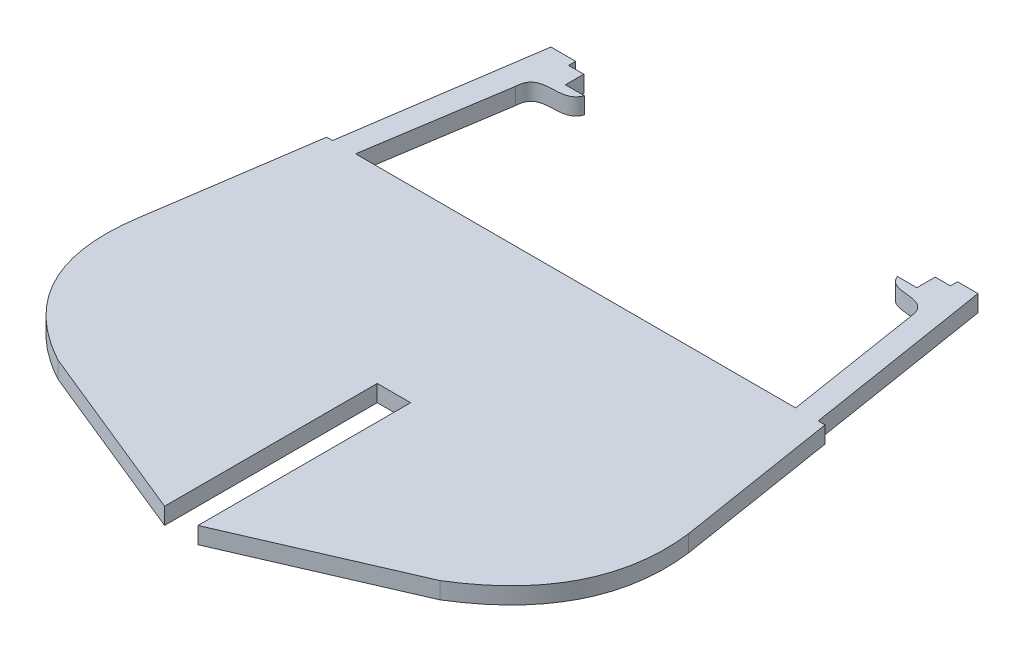
ISO-10303-21;
HEADER;
FILE_DESCRIPTION(('STEP AP214'),'2;1');
FILE_NAME('part.step','',(''),(''),'','','');
FILE_SCHEMA(('AUTOMOTIVE_DESIGN { 1 0 10303 214 1 1 1 1 }'));
ENDSEC;
DATA;
#1=APPLICATION_CONTEXT('core data for automotive mechanical design processes');
#2=APPLICATION_PROTOCOL_DEFINITION('international standard','automotive_design',2000,#1);
#3=PRODUCT_CONTEXT('',#1,'mechanical');
#4=PRODUCT('Part','Part','',(#3));
#5=PRODUCT_RELATED_PRODUCT_CATEGORY('part','',(#4));
#6=PRODUCT_DEFINITION_FORMATION('','',#4);
#7=PRODUCT_DEFINITION_CONTEXT('part definition',#1,'design');
#8=PRODUCT_DEFINITION('design','',#6,#7);
#9=PRODUCT_DEFINITION_SHAPE('','',#8);
#10=(LENGTH_UNIT() NAMED_UNIT(*) SI_UNIT(.MILLI.,.METRE.));
#11=(NAMED_UNIT(*) PLANE_ANGLE_UNIT() SI_UNIT($,.RADIAN.));
#12=(NAMED_UNIT(*) SI_UNIT($,.STERADIAN.) SOLID_ANGLE_UNIT());
#13=UNCERTAINTY_MEASURE_WITH_UNIT(LENGTH_MEASURE(1.E-05),#10,'distance_accuracy_value','');
#14=(GEOMETRIC_REPRESENTATION_CONTEXT(3) GLOBAL_UNCERTAINTY_ASSIGNED_CONTEXT((#13)) GLOBAL_UNIT_ASSIGNED_CONTEXT((#10,
#11,#12)) REPRESENTATION_CONTEXT('',''));
#15=CARTESIAN_POINT('',(0.,0.,0.));
#16=DIRECTION('',(0.,0.,1.));
#17=DIRECTION('',(1.,0.,0.));
#18=AXIS2_PLACEMENT_3D('',#15,#16,#17);
#19=CARTESIAN_POINT('',(-171.971094603398,4.,45.5989977087028));
#20=CARTESIAN_POINT('',(-176.165938525674,4.,72.0549755012516));
#21=CARTESIAN_POINT('',(-152.108080780971,4.,85.0989184092938));
#22=B_SPLINE_CURVE_WITH_KNOTS('',2,(#19,#20,#21),.UNSPECIFIED.,.F.,.F.,(3,3),(0.,1.),.UNSPECIFIED.);
#23=DIRECTION('',(0.,-1.,0.));
#24=VECTOR('',#23,1.);
#25=SURFACE_OF_LINEAR_EXTRUSION('',#22,#24);
#26=CARTESIAN_POINT('',(-171.971094603398,0.,45.5989977087028));
#27=CARTESIAN_POINT('',(-176.165938525674,0.,72.0549755012516));
#28=CARTESIAN_POINT('',(-152.108080780971,0.,85.0989184092938));
#29=B_SPLINE_CURVE_WITH_KNOTS('',2,(#26,#27,#28),.UNSPECIFIED.,.F.,.F.,(3,3),(0.,1.),.UNSPECIFIED.);
#30=CARTESIAN_POINT('',(-171.971094603398,0.,45.5989977087028));
#31=VERTEX_POINT('',#30);
#32=CARTESIAN_POINT('',(-152.108080780971,0.,85.0989184092938));
#33=VERTEX_POINT('',#32);
#34=EDGE_CURVE('E258',#31,#33,#29,.T.);
#35=ORIENTED_EDGE('',*,*,#34,.T.);
#36=DIRECTION('',(0.,-1.,0.));
#37=VECTOR('',#36,1.);
#38=CARTESIAN_POINT('',(-152.108080780971,4.,85.0989184092938));
#39=LINE('',#38,#37);
#40=CARTESIAN_POINT('',(-152.108080780971,4.,85.0989184092938));
#41=VERTEX_POINT('',#40);
#42=EDGE_CURVE('E11',#41,#33,#39,.T.);
#43=ORIENTED_EDGE('',*,*,#42,.F.);
#44=CARTESIAN_POINT('',(-171.971094603398,4.,45.5989977087028));
#45=VERTEX_POINT('',#44);
#46=EDGE_CURVE('E332',#45,#41,#22,.T.);
#47=ORIENTED_EDGE('',*,*,#46,.F.);
#48=DIRECTION('',(0.,-1.,0.));
#49=VECTOR('',#48,1.);
#50=CARTESIAN_POINT('',(-171.971094603398,4.,45.5989977087028));
#51=LINE('',#50,#49);
#52=EDGE_CURVE('E254',#45,#31,#51,.T.);
#53=ORIENTED_EDGE('',*,*,#52,.T.);
#54=EDGE_LOOP('',(#35,#43,#47,#53));
#55=FACE_BOUND('',#54,.T.);
#56=ADVANCED_FACE('F41',(#55),#25,.F.);
#57=CARTESIAN_POINT('',(-152.108080780971,4.,85.0989184092938));
#58=DIRECTION('',(0.377299218142206,0.,-0.926091410169256));
#59=DIRECTION('',(-0.926091410169256,0.,-0.377299218142206));
#60=AXIS2_PLACEMENT_3D('',#57,#58,#59);
#61=PLANE('',#60);
#62=DIRECTION('',(0.926091410169256,0.,0.377299218142206));
#63=VECTOR('',#62,1.);
#64=CARTESIAN_POINT('',(-152.108080780971,0.,85.0989184092938));
#65=LINE('',#64,#63);
#66=CARTESIAN_POINT('',(-109.02456762124,0.,102.651587240349));
#67=VERTEX_POINT('',#66);
#68=EDGE_CURVE('E263',#33,#67,#65,.T.);
#69=ORIENTED_EDGE('',*,*,#68,.T.);
#70=DIRECTION('',(0.,-1.,0.));
#71=VECTOR('',#70,1.);
#72=CARTESIAN_POINT('',(-109.02456762124,4.,102.651587240349));
#73=LINE('',#72,#71);
#74=CARTESIAN_POINT('',(-109.02456762124,4.,102.651587240349));
#75=VERTEX_POINT('',#74);
#76=EDGE_CURVE('E50',#75,#67,#73,.T.);
#77=ORIENTED_EDGE('',*,*,#76,.F.);
#78=DIRECTION('',(0.926091410169256,0.,0.377299218142206));
#79=VECTOR('',#78,1.);
#80=CARTESIAN_POINT('',(-152.108080780971,4.,85.0989184092938));
#81=LINE('',#80,#79);
#82=EDGE_CURVE('E161',#41,#75,#81,.T.);
#83=ORIENTED_EDGE('',*,*,#82,.F.);
#84=ORIENTED_EDGE('',*,*,#42,.T.);
#85=EDGE_LOOP('',(#69,#77,#83,#84));
#86=FACE_BOUND('',#85,.T.);
#87=ADVANCED_FACE('F458',(#86),#61,.F.);
#88=CARTESIAN_POINT('',(-109.02456762124,4.,102.651587240349));
#89=DIRECTION('',(-1.,0.,0.));
#90=DIRECTION('',(0.,0.,1.));
#91=AXIS2_PLACEMENT_3D('',#88,#89,#90);
#92=PLANE('',#91);
#93=DIRECTION('',(0.,0.,-1.));
#94=VECTOR('',#93,1.);
#95=CARTESIAN_POINT('',(-109.02456762124,0.,102.651587240349));
#96=LINE('',#95,#94);
#97=CARTESIAN_POINT('',(-109.02456762124,0.,51.6896517564781));
#98=VERTEX_POINT('',#97);
#99=EDGE_CURVE('E268',#67,#98,#96,.T.);
#100=ORIENTED_EDGE('',*,*,#99,.T.);
#101=DIRECTION('',(0.,-1.,0.));
#102=VECTOR('',#101,1.);
#103=CARTESIAN_POINT('',(-109.02456762124,4.,51.6896517564781));
#104=LINE('',#103,#102);
#105=CARTESIAN_POINT('',(-109.02456762124,4.,51.6896517564781));
#106=VERTEX_POINT('',#105);
#107=EDGE_CURVE('E399',#106,#98,#104,.T.);
#108=ORIENTED_EDGE('',*,*,#107,.F.);
#109=DIRECTION('',(0.,0.,-1.));
#110=VECTOR('',#109,1.);
#111=CARTESIAN_POINT('',(-109.02456762124,4.,102.651587240349));
#112=LINE('',#111,#110);
#113=EDGE_CURVE('E407',#75,#106,#112,.T.);
#114=ORIENTED_EDGE('',*,*,#113,.F.);
#115=ORIENTED_EDGE('',*,*,#76,.T.);
#116=EDGE_LOOP('',(#100,#108,#114,#115));
#117=FACE_BOUND('',#116,.T.);
#118=ADVANCED_FACE('F405',(#117),#92,.F.);
#119=CARTESIAN_POINT('',(-109.02456762124,4.,51.6896517564781));
#120=DIRECTION('',(0.,0.,-1.));
#121=DIRECTION('',(-1.,0.,0.));
#122=AXIS2_PLACEMENT_3D('',#119,#120,#121);
#123=PLANE('',#122);
#124=DIRECTION('',(1.,0.,0.));
#125=VECTOR('',#124,1.);
#126=CARTESIAN_POINT('',(-109.02456762124,0.,51.6896517564781));
#127=LINE('',#126,#125);
#128=CARTESIAN_POINT('',(-101.02456762124,0.,51.6896517564781));
#129=VERTEX_POINT('',#128);
#130=EDGE_CURVE('E270',#98,#129,#127,.T.);
#131=ORIENTED_EDGE('',*,*,#130,.T.);
#132=DIRECTION('',(0.,-1.,0.));
#133=VECTOR('',#132,1.);
#134=CARTESIAN_POINT('',(-101.02456762124,4.,51.6896517564781));
#135=LINE('',#134,#133);
#136=CARTESIAN_POINT('',(-101.02456762124,4.,51.6896517564781));
#137=VERTEX_POINT('',#136);
#138=EDGE_CURVE('E396',#137,#129,#135,.T.);
#139=ORIENTED_EDGE('',*,*,#138,.F.);
#140=DIRECTION('',(1.,0.,0.));
#141=VECTOR('',#140,1.);
#142=CARTESIAN_POINT('',(-109.02456762124,4.,51.6896517564781));
#143=LINE('',#142,#141);
#144=EDGE_CURVE('E425',#106,#137,#143,.T.);
#145=ORIENTED_EDGE('',*,*,#144,.F.);
#146=ORIENTED_EDGE('',*,*,#107,.T.);
#147=EDGE_LOOP('',(#131,#139,#145,#146));
#148=FACE_BOUND('',#147,.T.);
#149=ADVANCED_FACE('F416',(#148),#123,.F.);
#150=CARTESIAN_POINT('',(-101.02456762124,4.,51.6896517564781));
#151=DIRECTION('',(1.,0.,0.));
#152=DIRECTION('',(0.,0.,-1.));
#153=AXIS2_PLACEMENT_3D('',#150,#151,#152);
#154=PLANE('',#153);
#155=DIRECTION('',(0.,0.,1.));
#156=VECTOR('',#155,1.);
#157=CARTESIAN_POINT('',(-101.02456762124,0.,51.6896517564781));
#158=LINE('',#157,#156);
#159=CARTESIAN_POINT('',(-101.02456762124,0.,102.651587240349));
#160=VERTEX_POINT('',#159);
#161=EDGE_CURVE('E272',#129,#160,#158,.T.);
#162=ORIENTED_EDGE('',*,*,#161,.T.);
#163=DIRECTION('',(0.,-1.,0.));
#164=VECTOR('',#163,1.);
#165=CARTESIAN_POINT('',(-101.02456762124,4.,102.651587240349));
#166=LINE('',#165,#164);
#167=CARTESIAN_POINT('',(-101.02456762124,4.,102.651587240349));
#168=VERTEX_POINT('',#167);
#169=EDGE_CURVE('E393',#168,#160,#166,.T.);
#170=ORIENTED_EDGE('',*,*,#169,.F.);
#171=DIRECTION('',(0.,0.,1.));
#172=VECTOR('',#171,1.);
#173=CARTESIAN_POINT('',(-101.02456762124,4.,51.6896517564781));
#174=LINE('',#173,#172);
#175=EDGE_CURVE('E422',#137,#168,#174,.T.);
#176=ORIENTED_EDGE('',*,*,#175,.F.);
#177=ORIENTED_EDGE('',*,*,#138,.T.);
#178=EDGE_LOOP('',(#162,#170,#176,#177));
#179=FACE_BOUND('',#178,.T.);
#180=ADVANCED_FACE('F420',(#179),#154,.F.);
#181=CARTESIAN_POINT('',(-101.02456762124,4.,102.651587240349));
#182=DIRECTION('',(-0.398177992318918,0.,-0.917308174188411));
#183=DIRECTION('',(-0.917308174188411,0.,0.398177992318918));
#184=AXIS2_PLACEMENT_3D('',#181,#182,#183);
#185=PLANE('',#184);
#186=DIRECTION('',(0.917308174188411,0.,-0.398177992318918));
#187=VECTOR('',#186,1.);
#188=CARTESIAN_POINT('',(-101.02456762124,0.,102.651587240349));
#189=LINE('',#188,#187);
#190=CARTESIAN_POINT('',(-60.5873588649791,0.,85.0989184092938));
#191=VERTEX_POINT('',#190);
#192=EDGE_CURVE('E274',#160,#191,#189,.T.);
#193=ORIENTED_EDGE('',*,*,#192,.T.);
#194=DIRECTION('',(0.,-1.,0.));
#195=VECTOR('',#194,1.);
#196=CARTESIAN_POINT('',(-60.5873588649791,4.,85.0989184092938));
#197=LINE('',#196,#195);
#198=CARTESIAN_POINT('',(-60.5873588649791,4.,85.0989184092938));
#199=VERTEX_POINT('',#198);
#200=EDGE_CURVE('E390',#199,#191,#197,.T.);
#201=ORIENTED_EDGE('',*,*,#200,.F.);
#202=DIRECTION('',(0.917308174188411,0.,-0.398177992318918));
#203=VECTOR('',#202,1.);
#204=CARTESIAN_POINT('',(-101.02456762124,4.,102.651587240349));
#205=LINE('',#204,#203);
#206=EDGE_CURVE('E424',#168,#199,#205,.T.);
#207=ORIENTED_EDGE('',*,*,#206,.F.);
#208=ORIENTED_EDGE('',*,*,#169,.T.);
#209=EDGE_LOOP('',(#193,#201,#207,#208));
#210=FACE_BOUND('',#209,.T.);
#211=ADVANCED_FACE('F447',(#210),#185,.F.);
#212=CARTESIAN_POINT('',(-60.5873588649791,4.,85.0989184092938));
#213=CARTESIAN_POINT('',(-37.3326829317799,4.,70.8151017540015));
#214=CARTESIAN_POINT('',(-40.5252980418875,4.,45.5989977087028));
#215=B_SPLINE_CURVE_WITH_KNOTS('',2,(#212,#213,#214),.UNSPECIFIED.,.F.,.F.,(3,3),(0.,1.),.UNSPECIFIED.);
#216=DIRECTION('',(0.,-1.,0.));
#217=VECTOR('',#216,1.);
#218=SURFACE_OF_LINEAR_EXTRUSION('',#215,#217);
#219=CARTESIAN_POINT('',(-60.5873588649791,0.,85.0989184092938));
#220=CARTESIAN_POINT('',(-37.3326829317799,0.,70.8151017540015));
#221=CARTESIAN_POINT('',(-40.5252980418875,0.,45.5989977087028));
#222=B_SPLINE_CURVE_WITH_KNOTS('',2,(#219,#220,#221),.UNSPECIFIED.,.F.,.F.,(3,3),(0.,1.),.UNSPECIFIED.);
#223=CARTESIAN_POINT('',(-40.5252980418875,0.,45.5989977087028));
#224=VERTEX_POINT('',#223);
#225=EDGE_CURVE('E276',#191,#224,#222,.T.);
#226=ORIENTED_EDGE('',*,*,#225,.T.);
#227=DIRECTION('',(0.,-1.,0.));
#228=VECTOR('',#227,1.);
#229=CARTESIAN_POINT('',(-40.5252980418875,4.,45.5989977087028));
#230=LINE('',#229,#228);
#231=CARTESIAN_POINT('',(-40.5252980418875,4.,45.5989977087028));
#232=VERTEX_POINT('',#231);
#233=EDGE_CURVE('E387',#232,#224,#230,.T.);
#234=ORIENTED_EDGE('',*,*,#233,.F.);
#235=EDGE_CURVE('E427',#199,#232,#215,.T.);
#236=ORIENTED_EDGE('',*,*,#235,.F.);
#237=ORIENTED_EDGE('',*,*,#200,.T.);
#238=EDGE_LOOP('',(#226,#234,#236,#237));
#239=FACE_BOUND('',#238,.T.);
#240=ADVANCED_FACE('F442',(#239),#218,.F.);
#241=CARTESIAN_POINT('',(-46.7586783556946,4.,6.62726172799195));
#242=DIRECTION('',(-0.987448921368729,0.,0.157938683316452));
#243=DIRECTION('',(0.157938683316452,0.,0.987448921368729));
#244=AXIS2_PLACEMENT_3D('',#241,#242,#243);
#245=PLANE('',#244);
#246=DIRECTION('',(-0.157938683316452,0.,-0.987448921368729));
#247=VECTOR('',#246,1.);
#248=CARTESIAN_POINT('',(-46.7586783556946,0.,6.62726172799195));
#249=LINE('',#248,#247);
#250=CARTESIAN_POINT('',(-46.7586783556946,0.,6.62726172799195));
#251=VERTEX_POINT('',#250);
#252=EDGE_CURVE('E280',#224,#251,#249,.T.);
#253=ORIENTED_EDGE('',*,*,#252,.T.);
#254=DIRECTION('',(0.,-1.,0.));
#255=VECTOR('',#254,1.);
#256=CARTESIAN_POINT('',(-46.7586783556946,4.,6.62726172799195));
#257=LINE('',#256,#255);
#258=CARTESIAN_POINT('',(-46.7586783556946,4.,6.62726172799195));
#259=VERTEX_POINT('',#258);
#260=EDGE_CURVE('E384',#259,#251,#257,.T.);
#261=ORIENTED_EDGE('',*,*,#260,.F.);
#262=DIRECTION('',(-0.157938683316452,0.,-0.987448921368729));
#263=VECTOR('',#262,1.);
#264=CARTESIAN_POINT('',(-46.7586783556946,4.,6.62726172799195));
#265=LINE('',#264,#263);
#266=EDGE_CURVE('E436',#232,#259,#265,.T.);
#267=ORIENTED_EDGE('',*,*,#266,.F.);
#268=ORIENTED_EDGE('',*,*,#233,.T.);
#269=EDGE_LOOP('',(#253,#261,#267,#268));
#270=FACE_BOUND('',#269,.T.);
#271=ADVANCED_FACE('F446',(#270),#245,.F.);
#272=CARTESIAN_POINT('',(-48.3929769613373,4.,6.62726172799195));
#273=DIRECTION('',(0.,0.,1.));
#274=DIRECTION('',(1.,0.,0.));
#275=AXIS2_PLACEMENT_3D('',#272,#273,#274);
#276=PLANE('',#275);
#277=DIRECTION('',(-1.,0.,0.));
#278=VECTOR('',#277,1.);
#279=CARTESIAN_POINT('',(-48.3929769613373,0.,6.62726172799195));
#280=LINE('',#279,#278);
#281=CARTESIAN_POINT('',(-48.3929769613373,0.,6.62726172799195));
#282=VERTEX_POINT('',#281);
#283=EDGE_CURVE('E285',#251,#282,#280,.T.);
#284=ORIENTED_EDGE('',*,*,#283,.T.);
#285=DIRECTION('',(0.,-1.,0.));
#286=VECTOR('',#285,1.);
#287=CARTESIAN_POINT('',(-48.3929769613373,4.,6.62726172799195));
#288=LINE('',#287,#286);
#289=CARTESIAN_POINT('',(-48.3929769613373,4.,6.62726172799195));
#290=VERTEX_POINT('',#289);
#291=EDGE_CURVE('E381',#290,#282,#288,.T.);
#292=ORIENTED_EDGE('',*,*,#291,.F.);
#293=DIRECTION('',(-1.,0.,0.));
#294=VECTOR('',#293,1.);
#295=CARTESIAN_POINT('',(-48.3929769613373,4.,6.62726172799195));
#296=LINE('',#295,#294);
#297=EDGE_CURVE('E565',#259,#290,#296,.T.);
#298=ORIENTED_EDGE('',*,*,#297,.F.);
#299=ORIENTED_EDGE('',*,*,#260,.T.);
#300=EDGE_LOOP('',(#284,#292,#298,#299));
#301=FACE_BOUND('',#300,.T.);
#302=ADVANCED_FACE('F564',(#301),#276,.F.);
#303=CARTESIAN_POINT('',(-55.684463048051,4.,-38.9598605672746));
#304=DIRECTION('',(-0.987448921368729,0.,0.157938683316453));
#305=DIRECTION('',(0.157938683316453,0.,0.987448921368729));
#306=AXIS2_PLACEMENT_3D('',#303,#304,#305);
#307=PLANE('',#306);
#308=DIRECTION('',(-0.157938683316452,0.,-0.987448921368728));
#309=VECTOR('',#308,1.);
#310=CARTESIAN_POINT('',(-55.684463048051,0.,-38.9598605672746));
#311=LINE('',#310,#309);
#312=CARTESIAN_POINT('',(-55.684463048051,0.,-38.9598605672746));
#313=VERTEX_POINT('',#312);
#314=EDGE_CURVE('E287',#282,#313,#311,.T.);
#315=ORIENTED_EDGE('',*,*,#314,.T.);
#316=DIRECTION('',(0.,-1.,0.));
#317=VECTOR('',#316,1.);
#318=CARTESIAN_POINT('',(-55.684463048051,4.,-38.9598605672746));
#319=LINE('',#318,#317);
#320=CARTESIAN_POINT('',(-55.684463048051,4.,-38.9598605672746));
#321=VERTEX_POINT('',#320);
#322=EDGE_CURVE('E378',#321,#313,#319,.T.);
#323=ORIENTED_EDGE('',*,*,#322,.F.);
#324=DIRECTION('',(-0.157938683316452,0.,-0.987448921368728));
#325=VECTOR('',#324,1.);
#326=CARTESIAN_POINT('',(-55.684463048051,4.,-38.9598605672746));
#327=LINE('',#326,#325);
#328=EDGE_CURVE('E561',#290,#321,#327,.T.);
#329=ORIENTED_EDGE('',*,*,#328,.F.);
#330=ORIENTED_EDGE('',*,*,#291,.T.);
#331=EDGE_LOOP('',(#315,#323,#329,#330));
#332=FACE_BOUND('',#331,.T.);
#333=ADVANCED_FACE('F558',(#332),#307,.F.);
#334=CARTESIAN_POINT('',(-60.5873588649791,4.,-38.9598605672746));
#335=DIRECTION('',(0.,0.,1.));
#336=DIRECTION('',(1.,0.,0.));
#337=AXIS2_PLACEMENT_3D('',#334,#335,#336);
#338=PLANE('',#337);
#339=DIRECTION('',(-1.,0.,0.));
#340=VECTOR('',#339,1.);
#341=CARTESIAN_POINT('',(-60.5873588649791,0.,-38.9598605672746));
#342=LINE('',#341,#340);
#343=CARTESIAN_POINT('',(-60.5873588649791,0.,-38.9598605672746));
#344=VERTEX_POINT('',#343);
#345=EDGE_CURVE('E289',#313,#344,#342,.T.);
#346=ORIENTED_EDGE('',*,*,#345,.T.);
#347=DIRECTION('',(0.,-1.,0.));
#348=VECTOR('',#347,1.);
#349=CARTESIAN_POINT('',(-60.5873588649791,4.,-38.9598605672746));
#350=LINE('',#349,#348);
#351=CARTESIAN_POINT('',(-60.5873588649791,4.,-38.9598605672746));
#352=VERTEX_POINT('',#351);
#353=EDGE_CURVE('E375',#352,#344,#350,.T.);
#354=ORIENTED_EDGE('',*,*,#353,.F.);
#355=DIRECTION('',(-1.,0.,0.));
#356=VECTOR('',#355,1.);
#357=CARTESIAN_POINT('',(-60.5873588649791,4.,-38.9598605672746));
#358=LINE('',#357,#356);
#359=EDGE_CURVE('E552',#321,#352,#358,.T.);
#360=ORIENTED_EDGE('',*,*,#359,.F.);
#361=ORIENTED_EDGE('',*,*,#322,.T.);
#362=EDGE_LOOP('',(#346,#354,#360,#361));
#363=FACE_BOUND('',#362,.T.);
#364=ADVANCED_FACE('F551',(#363),#338,.F.);
#365=CARTESIAN_POINT('',(-60.5873588649791,4.,-37.247370069647));
#366=DIRECTION('',(1.,0.,0.));
#367=DIRECTION('',(0.,0.,-1.));
#368=AXIS2_PLACEMENT_3D('',#365,#366,#367);
#369=PLANE('',#368);
#370=DIRECTION('',(0.,0.,1.));
#371=VECTOR('',#370,1.);
#372=CARTESIAN_POINT('',(-60.5873588649791,0.,-37.247370069647));
#373=LINE('',#372,#371);
#374=CARTESIAN_POINT('',(-60.5873588649791,0.,-37.247370069647));
#375=VERTEX_POINT('',#374);
#376=EDGE_CURVE('E291',#344,#375,#373,.T.);
#377=ORIENTED_EDGE('',*,*,#376,.T.);
#378=DIRECTION('',(0.,-1.,0.));
#379=VECTOR('',#378,1.);
#380=CARTESIAN_POINT('',(-60.5873588649791,4.,-37.247370069647));
#381=LINE('',#380,#379);
#382=CARTESIAN_POINT('',(-60.5873588649791,4.,-37.247370069647));
#383=VERTEX_POINT('',#382);
#384=EDGE_CURVE('E372',#383,#375,#381,.T.);
#385=ORIENTED_EDGE('',*,*,#384,.F.);
#386=DIRECTION('',(0.,0.,1.));
#387=VECTOR('',#386,1.);
#388=CARTESIAN_POINT('',(-60.5873588649791,4.,-37.247370069647));
#389=LINE('',#388,#387);
#390=EDGE_CURVE('E547',#352,#383,#389,.T.);
#391=ORIENTED_EDGE('',*,*,#390,.F.);
#392=ORIENTED_EDGE('',*,*,#353,.T.);
#393=EDGE_LOOP('',(#377,#385,#391,#392));
#394=FACE_BOUND('',#393,.T.);
#395=ADVANCED_FACE('F546',(#394),#369,.F.);
#396=CARTESIAN_POINT('',(-64.233101908336,4.,-37.247370069647));
#397=DIRECTION('',(0.,0.,1.));
#398=DIRECTION('',(1.,0.,0.));
#399=AXIS2_PLACEMENT_3D('',#396,#397,#398);
#400=PLANE('',#399);
#401=DIRECTION('',(-1.,0.,0.));
#402=VECTOR('',#401,1.);
#403=CARTESIAN_POINT('',(-64.233101908336,0.,-37.247370069647));
#404=LINE('',#403,#402);
#405=CARTESIAN_POINT('',(-64.233101908336,0.,-37.247370069647));
#406=VERTEX_POINT('',#405);
#407=EDGE_CURVE('E293',#375,#406,#404,.T.);
#408=ORIENTED_EDGE('',*,*,#407,.T.);
#409=DIRECTION('',(0.,-1.,0.));
#410=VECTOR('',#409,1.);
#411=CARTESIAN_POINT('',(-64.233101908336,4.,-37.247370069647));
#412=LINE('',#411,#410);
#413=CARTESIAN_POINT('',(-64.233101908336,4.,-37.247370069647));
#414=VERTEX_POINT('',#413);
#415=EDGE_CURVE('E369',#414,#406,#412,.T.);
#416=ORIENTED_EDGE('',*,*,#415,.F.);
#417=DIRECTION('',(-1.,0.,0.));
#418=VECTOR('',#417,1.);
#419=CARTESIAN_POINT('',(-64.233101908336,4.,-37.247370069647));
#420=LINE('',#419,#418);
#421=EDGE_CURVE('E543',#383,#414,#420,.T.);
#422=ORIENTED_EDGE('',*,*,#421,.F.);
#423=ORIENTED_EDGE('',*,*,#384,.T.);
#424=EDGE_LOOP('',(#408,#416,#422,#423));
#425=FACE_BOUND('',#424,.T.);
#426=ADVANCED_FACE('F540',(#425),#400,.F.);
#427=CARTESIAN_POINT('',(-64.233101908336,4.,-32.8473353621474));
#428=DIRECTION('',(1.,0.,0.));
#429=DIRECTION('',(0.,0.,-1.));
#430=AXIS2_PLACEMENT_3D('',#427,#428,#429);
#431=PLANE('',#430);
#432=DIRECTION('',(0.,0.,1.));
#433=VECTOR('',#432,1.);
#434=CARTESIAN_POINT('',(-64.233101908336,0.,-32.8473353621474));
#435=LINE('',#434,#433);
#436=CARTESIAN_POINT('',(-64.233101908336,0.,-32.8473353621474));
#437=VERTEX_POINT('',#436);
#438=EDGE_CURVE('E295',#406,#437,#435,.T.);
#439=ORIENTED_EDGE('',*,*,#438,.T.);
#440=DIRECTION('',(0.,-1.,0.));
#441=VECTOR('',#440,1.);
#442=CARTESIAN_POINT('',(-64.233101908336,4.,-32.8473353621474));
#443=LINE('',#442,#441);
#444=CARTESIAN_POINT('',(-64.233101908336,4.,-32.8473353621474));
#445=VERTEX_POINT('',#444);
#446=EDGE_CURVE('E366',#445,#437,#443,.T.);
#447=ORIENTED_EDGE('',*,*,#446,.F.);
#448=DIRECTION('',(0.,0.,1.));
#449=VECTOR('',#448,1.);
#450=CARTESIAN_POINT('',(-64.233101908336,4.,-32.8473353621474));
#451=LINE('',#450,#449);
#452=EDGE_CURVE('E534',#414,#445,#451,.T.);
#453=ORIENTED_EDGE('',*,*,#452,.F.);
#454=ORIENTED_EDGE('',*,*,#415,.T.);
#455=EDGE_LOOP('',(#439,#447,#453,#454));
#456=FACE_BOUND('',#455,.T.);
#457=ADVANCED_FACE('F533',(#456),#431,.F.);
#458=CARTESIAN_POINT('',(-68.8845671705498,4.,-32.8473353621474));
#459=DIRECTION('',(0.,0.,1.));
#460=DIRECTION('',(1.,0.,0.));
#461=AXIS2_PLACEMENT_3D('',#458,#459,#460);
#462=PLANE('',#461);
#463=DIRECTION('',(-1.,0.,0.));
#464=VECTOR('',#463,1.);
#465=CARTESIAN_POINT('',(-68.8845671705498,0.,-32.8473353621474));
#466=LINE('',#465,#464);
#467=CARTESIAN_POINT('',(-68.8845671705498,0.,-32.8473353621474));
#468=VERTEX_POINT('',#467);
#469=EDGE_CURVE('E297',#437,#468,#466,.T.);
#470=ORIENTED_EDGE('',*,*,#469,.T.);
#471=DIRECTION('',(0.,-1.,0.));
#472=VECTOR('',#471,1.);
#473=CARTESIAN_POINT('',(-68.8845671705498,4.,-32.8473353621474));
#474=LINE('',#473,#472);
#475=CARTESIAN_POINT('',(-68.8845671705498,4.,-32.8473353621474));
#476=VERTEX_POINT('',#475);
#477=EDGE_CURVE('E363',#476,#468,#474,.T.);
#478=ORIENTED_EDGE('',*,*,#477,.F.);
#479=DIRECTION('',(-1.,0.,0.));
#480=VECTOR('',#479,1.);
#481=CARTESIAN_POINT('',(-68.8845671705498,4.,-32.8473353621474));
#482=LINE('',#481,#480);
#483=EDGE_CURVE('E529',#445,#476,#482,.T.);
#484=ORIENTED_EDGE('',*,*,#483,.F.);
#485=ORIENTED_EDGE('',*,*,#446,.T.);
#486=EDGE_LOOP('',(#470,#478,#484,#485));
#487=FACE_BOUND('',#486,.T.);
#488=ADVANCED_FACE('F528',(#487),#462,.F.);
#489=CARTESIAN_POINT('',(-68.8845671705498,4.,-32.8473353621474));
#490=CARTESIAN_POINT('',(-67.1834706304564,4.,-28.2386260721321));
#491=CARTESIAN_POINT('',(-59.8753345983897,4.,-32.556519598356));
#492=CARTESIAN_POINT('',(-59.0787755366935,4.,-26.5615714942908));
#493=B_SPLINE_CURVE_WITH_KNOTS('',3,(#489,#490,#491,#492),.UNSPECIFIED.,.F.,.F.,(4,4),(0.,1.),.UNSPECIFIED.);
#494=DIRECTION('',(0.,-1.,0.));
#495=VECTOR('',#494,1.);
#496=SURFACE_OF_LINEAR_EXTRUSION('',#493,#495);
#497=CARTESIAN_POINT('',(-68.8845671705498,0.,-32.8473353621474));
#498=CARTESIAN_POINT('',(-67.1834706304564,0.,-28.2386260721321));
#499=CARTESIAN_POINT('',(-59.8753345983897,0.,-32.556519598356));
#500=CARTESIAN_POINT('',(-59.0787755366935,0.,-26.5615714942908));
#501=B_SPLINE_CURVE_WITH_KNOTS('',3,(#497,#498,#499,#500),.UNSPECIFIED.,.F.,.F.,(4,4),(0.,1.),.UNSPECIFIED.);
#502=CARTESIAN_POINT('',(-59.0787755366935,0.,-26.5615714942908));
#503=VERTEX_POINT('',#502);
#504=EDGE_CURVE('E299',#468,#503,#501,.T.);
#505=ORIENTED_EDGE('',*,*,#504,.T.);
#506=DIRECTION('',(0.,-1.,0.));
#507=VECTOR('',#506,1.);
#508=CARTESIAN_POINT('',(-59.0787755366935,4.,-26.5615714942908));
#509=LINE('',#508,#507);
#510=CARTESIAN_POINT('',(-59.0787755366935,4.,-26.5615714942908));
#511=VERTEX_POINT('',#510);
#512=EDGE_CURVE('E360',#511,#503,#509,.T.);
#513=ORIENTED_EDGE('',*,*,#512,.F.);
#514=EDGE_CURVE('E525',#476,#511,#493,.T.);
#515=ORIENTED_EDGE('',*,*,#514,.F.);
#516=ORIENTED_EDGE('',*,*,#477,.T.);
#517=EDGE_LOOP('',(#505,#513,#515,#516));
#518=FACE_BOUND('',#517,.T.);
#519=ADVANCED_FACE('F522',(#518),#496,.F.);
#520=CARTESIAN_POINT('',(-53.798733887694,4.,6.62726172799195));
#521=DIRECTION('',(0.987580306335114,0.,-0.157115048735131));
#522=DIRECTION('',(-0.157115048735131,0.,-0.987580306335114));
#523=AXIS2_PLACEMENT_3D('',#520,#521,#522);
#524=PLANE('',#523);
#525=DIRECTION('',(0.157115048735131,0.,0.987580306335114));
#526=VECTOR('',#525,1.);
#527=CARTESIAN_POINT('',(-53.798733887694,0.,6.62726172799195));
#528=LINE('',#527,#526);
#529=CARTESIAN_POINT('',(-53.798733887694,0.,6.62726172799195));
#530=VERTEX_POINT('',#529);
#531=EDGE_CURVE('E303',#503,#530,#528,.T.);
#532=ORIENTED_EDGE('',*,*,#531,.T.);
#533=DIRECTION('',(0.,-1.,0.));
#534=VECTOR('',#533,1.);
#535=CARTESIAN_POINT('',(-53.798733887694,4.,6.62726172799195));
#536=LINE('',#535,#534);
#537=CARTESIAN_POINT('',(-53.798733887694,4.,6.62726172799195));
#538=VERTEX_POINT('',#537);
#539=EDGE_CURVE('E357',#538,#530,#536,.T.);
#540=ORIENTED_EDGE('',*,*,#539,.F.);
#541=DIRECTION('',(0.157115048735131,0.,0.987580306335114));
#542=VECTOR('',#541,1.);
#543=CARTESIAN_POINT('',(-53.798733887694,4.,6.62726172799195));
#544=LINE('',#543,#542);
#545=EDGE_CURVE('E516',#511,#538,#544,.T.);
#546=ORIENTED_EDGE('',*,*,#545,.F.);
#547=ORIENTED_EDGE('',*,*,#512,.T.);
#548=EDGE_LOOP('',(#532,#540,#546,#547));
#549=FACE_BOUND('',#548,.T.);
#550=ADVANCED_FACE('F515',(#549),#524,.F.);
#551=CARTESIAN_POINT('',(-159.273851590327,4.,6.62726172799195));
#552=DIRECTION('',(0.,0.,1.));
#553=DIRECTION('',(1.,0.,0.));
#554=AXIS2_PLACEMENT_3D('',#551,#552,#553);
#555=PLANE('',#554);
#556=DIRECTION('',(-1.,0.,0.));
#557=VECTOR('',#556,1.);
#558=CARTESIAN_POINT('',(-159.273851590327,0.,6.62726172799195));
#559=LINE('',#558,#557);
#560=CARTESIAN_POINT('',(-159.273851590327,0.,6.62726172799195));
#561=VERTEX_POINT('',#560);
#562=EDGE_CURVE('E308',#530,#561,#559,.T.);
#563=ORIENTED_EDGE('',*,*,#562,.T.);
#564=DIRECTION('',(0.,-1.,0.));
#565=VECTOR('',#564,1.);
#566=CARTESIAN_POINT('',(-159.273851590327,4.,6.62726172799195));
#567=LINE('',#566,#565);
#568=CARTESIAN_POINT('',(-159.273851590327,4.,6.62726172799195));
#569=VERTEX_POINT('',#568);
#570=EDGE_CURVE('E354',#569,#561,#567,.T.);
#571=ORIENTED_EDGE('',*,*,#570,.F.);
#572=DIRECTION('',(-1.,0.,0.));
#573=VECTOR('',#572,1.);
#574=CARTESIAN_POINT('',(-159.273851590327,4.,6.62726172799195));
#575=LINE('',#574,#573);
#576=EDGE_CURVE('E511',#538,#569,#575,.T.);
#577=ORIENTED_EDGE('',*,*,#576,.F.);
#578=ORIENTED_EDGE('',*,*,#539,.T.);
#579=EDGE_LOOP('',(#563,#571,#577,#578));
#580=FACE_BOUND('',#579,.T.);
#581=ADVANCED_FACE('F510',(#580),#555,.F.);
#582=CARTESIAN_POINT('',(-154.119525218685,4.,-26.5615714942908));
#583=DIRECTION('',(-0.988154338236309,0.,-0.153463363135184));
#584=DIRECTION('',(-0.153463363135184,0.,0.98815433823631));
#585=AXIS2_PLACEMENT_3D('',#582,#583,#584);
#586=PLANE('',#585);
#587=DIRECTION('',(0.153463363135184,0.,-0.98815433823631));
#588=VECTOR('',#587,1.);
#589=CARTESIAN_POINT('',(-154.119525218685,0.,-26.5615714942908));
#590=LINE('',#589,#588);
#591=CARTESIAN_POINT('',(-154.119525218685,0.,-26.5615714942908));
#592=VERTEX_POINT('',#591);
#593=EDGE_CURVE('E310',#561,#592,#590,.T.);
#594=ORIENTED_EDGE('',*,*,#593,.T.);
#595=DIRECTION('',(0.,-1.,0.));
#596=VECTOR('',#595,1.);
#597=CARTESIAN_POINT('',(-154.119525218685,4.,-26.5615714942908));
#598=LINE('',#597,#596);
#599=CARTESIAN_POINT('',(-154.119525218685,4.,-26.5615714942908));
#600=VERTEX_POINT('',#599);
#601=EDGE_CURVE('E351',#600,#592,#598,.T.);
#602=ORIENTED_EDGE('',*,*,#601,.F.);
#603=DIRECTION('',(0.153463363135184,0.,-0.98815433823631));
#604=VECTOR('',#603,1.);
#605=CARTESIAN_POINT('',(-154.119525218685,4.,-26.5615714942908));
#606=LINE('',#605,#604);
#607=EDGE_CURVE('E507',#569,#600,#606,.T.);
#608=ORIENTED_EDGE('',*,*,#607,.F.);
#609=ORIENTED_EDGE('',*,*,#570,.T.);
#610=EDGE_LOOP('',(#594,#602,#608,#609));
#611=FACE_BOUND('',#610,.T.);
#612=ADVANCED_FACE('F504',(#611),#586,.F.);
#613=CARTESIAN_POINT('',(-154.119525218685,4.,-26.5615714942908));
#614=CARTESIAN_POINT('',(-153.862596813139,4.,-33.2347551385878));
#615=CARTESIAN_POINT('',(-145.689971567288,4.,-27.9886798840841));
#616=CARTESIAN_POINT('',(-143.936587752757,4.,-32.8473353621474));
#617=B_SPLINE_CURVE_WITH_KNOTS('',3,(#613,#614,#615,#616),.UNSPECIFIED.,.F.,.F.,(4,4),(0.,1.),.UNSPECIFIED.);
#618=DIRECTION('',(0.,-1.,0.));
#619=VECTOR('',#618,1.);
#620=SURFACE_OF_LINEAR_EXTRUSION('',#617,#619);
#621=CARTESIAN_POINT('',(-154.119525218685,0.,-26.5615714942908));
#622=CARTESIAN_POINT('',(-153.862596813139,0.,-33.2347551385878));
#623=CARTESIAN_POINT('',(-145.689971567288,0.,-27.9886798840841));
#624=CARTESIAN_POINT('',(-143.936587752757,0.,-32.8473353621474));
#625=B_SPLINE_CURVE_WITH_KNOTS('',3,(#621,#622,#623,#624),.UNSPECIFIED.,.F.,.F.,(4,4),(0.,1.),.UNSPECIFIED.);
#626=CARTESIAN_POINT('',(-143.936587752757,0.,-32.8473353621474));
#627=VERTEX_POINT('',#626);
#628=EDGE_CURVE('E312',#592,#627,#625,.T.);
#629=ORIENTED_EDGE('',*,*,#628,.T.);
#630=DIRECTION('',(0.,-1.,0.));
#631=VECTOR('',#630,1.);
#632=CARTESIAN_POINT('',(-143.936587752757,4.,-32.8473353621474));
#633=LINE('',#632,#631);
#634=CARTESIAN_POINT('',(-143.936587752757,4.,-32.8473353621474));
#635=VERTEX_POINT('',#634);
#636=EDGE_CURVE('E348',#635,#627,#633,.T.);
#637=ORIENTED_EDGE('',*,*,#636,.F.);
#638=EDGE_CURVE('E498',#600,#635,#617,.T.);
#639=ORIENTED_EDGE('',*,*,#638,.F.);
#640=ORIENTED_EDGE('',*,*,#601,.T.);
#641=EDGE_LOOP('',(#629,#637,#639,#640));
#642=FACE_BOUND('',#641,.T.);
#643=ADVANCED_FACE('F497',(#642),#620,.F.);
#644=CARTESIAN_POINT('',(-148.462337737614,4.,-32.8473353621474));
#645=DIRECTION('',(0.,0.,1.));
#646=DIRECTION('',(1.,0.,0.));
#647=AXIS2_PLACEMENT_3D('',#644,#645,#646);
#648=PLANE('',#647);
#649=DIRECTION('',(-1.,0.,0.));
#650=VECTOR('',#649,1.);
#651=CARTESIAN_POINT('',(-148.462337737614,0.,-32.8473353621474));
#652=LINE('',#651,#650);
#653=CARTESIAN_POINT('',(-148.462337737614,0.,-32.8473353621474));
#654=VERTEX_POINT('',#653);
#655=EDGE_CURVE('E316',#627,#654,#652,.T.);
#656=ORIENTED_EDGE('',*,*,#655,.T.);
#657=DIRECTION('',(0.,-1.,0.));
#658=VECTOR('',#657,1.);
#659=CARTESIAN_POINT('',(-148.462337737614,4.,-32.8473353621474));
#660=LINE('',#659,#658);
#661=CARTESIAN_POINT('',(-148.462337737614,4.,-32.8473353621474));
#662=VERTEX_POINT('',#661);
#663=EDGE_CURVE('E345',#662,#654,#660,.T.);
#664=ORIENTED_EDGE('',*,*,#663,.F.);
#665=DIRECTION('',(-1.,0.,0.));
#666=VECTOR('',#665,1.);
#667=CARTESIAN_POINT('',(-148.462337737614,4.,-32.8473353621474));
#668=LINE('',#667,#666);
#669=EDGE_CURVE('E493',#635,#662,#668,.T.);
#670=ORIENTED_EDGE('',*,*,#669,.F.);
#671=ORIENTED_EDGE('',*,*,#636,.T.);
#672=EDGE_LOOP('',(#656,#664,#670,#671));
#673=FACE_BOUND('',#672,.T.);
#674=ADVANCED_FACE('F492',(#673),#648,.F.);
#675=CARTESIAN_POINT('',(-148.462337737614,4.,-37.247370069647));
#676=DIRECTION('',(-1.,0.,0.));
#677=DIRECTION('',(0.,0.,1.));
#678=AXIS2_PLACEMENT_3D('',#675,#676,#677);
#679=PLANE('',#678);
#680=DIRECTION('',(0.,0.,-1.));
#681=VECTOR('',#680,1.);
#682=CARTESIAN_POINT('',(-148.462337737614,0.,-37.247370069647));
#683=LINE('',#682,#681);
#684=CARTESIAN_POINT('',(-148.462337737614,0.,-37.247370069647));
#685=VERTEX_POINT('',#684);
#686=EDGE_CURVE('E321',#654,#685,#683,.T.);
#687=ORIENTED_EDGE('',*,*,#686,.T.);
#688=DIRECTION('',(0.,-1.,0.));
#689=VECTOR('',#688,1.);
#690=CARTESIAN_POINT('',(-148.462337737614,4.,-37.247370069647));
#691=LINE('',#690,#689);
#692=CARTESIAN_POINT('',(-148.462337737614,4.,-37.247370069647));
#693=VERTEX_POINT('',#692);
#694=EDGE_CURVE('E342',#693,#685,#691,.T.);
#695=ORIENTED_EDGE('',*,*,#694,.F.);
#696=DIRECTION('',(0.,0.,-1.));
#697=VECTOR('',#696,1.);
#698=CARTESIAN_POINT('',(-148.462337737614,4.,-37.247370069647));
#699=LINE('',#698,#697);
#700=EDGE_CURVE('E489',#662,#693,#699,.T.);
#701=ORIENTED_EDGE('',*,*,#700,.F.);
#702=ORIENTED_EDGE('',*,*,#663,.T.);
#703=EDGE_LOOP('',(#687,#695,#701,#702));
#704=FACE_BOUND('',#703,.T.);
#705=ADVANCED_FACE('F486',(#704),#679,.F.);
#706=CARTESIAN_POINT('',(-152.108080780971,4.,-37.247370069647));
#707=DIRECTION('',(0.,0.,1.));
#708=DIRECTION('',(1.,0.,0.));
#709=AXIS2_PLACEMENT_3D('',#706,#707,#708);
#710=PLANE('',#709);
#711=DIRECTION('',(-1.,0.,0.));
#712=VECTOR('',#711,1.);
#713=CARTESIAN_POINT('',(-152.108080780971,0.,-37.247370069647));
#714=LINE('',#713,#712);
#715=CARTESIAN_POINT('',(-152.108080780971,0.,-37.247370069647));
#716=VERTEX_POINT('',#715);
#717=EDGE_CURVE('E323',#685,#716,#714,.T.);
#718=ORIENTED_EDGE('',*,*,#717,.T.);
#719=DIRECTION('',(0.,-1.,0.));
#720=VECTOR('',#719,1.);
#721=CARTESIAN_POINT('',(-152.108080780971,4.,-37.247370069647));
#722=LINE('',#721,#720);
#723=CARTESIAN_POINT('',(-152.108080780971,4.,-37.247370069647));
#724=VERTEX_POINT('',#723);
#725=EDGE_CURVE('E339',#724,#716,#722,.T.);
#726=ORIENTED_EDGE('',*,*,#725,.F.);
#727=DIRECTION('',(-1.,0.,0.));
#728=VECTOR('',#727,1.);
#729=CARTESIAN_POINT('',(-152.108080780971,4.,-37.247370069647));
#730=LINE('',#729,#728);
#731=EDGE_CURVE('E480',#693,#724,#730,.T.);
#732=ORIENTED_EDGE('',*,*,#731,.F.);
#733=ORIENTED_EDGE('',*,*,#694,.T.);
#734=EDGE_LOOP('',(#718,#726,#732,#733));
#735=FACE_BOUND('',#734,.T.);
#736=ADVANCED_FACE('F479',(#735),#710,.F.);
#737=CARTESIAN_POINT('',(-152.108080780971,4.,-38.9598605672746));
#738=DIRECTION('',(-1.,0.,0.));
#739=DIRECTION('',(0.,0.,1.));
#740=AXIS2_PLACEMENT_3D('',#737,#738,#739);
#741=PLANE('',#740);
#742=DIRECTION('',(0.,0.,-1.));
#743=VECTOR('',#742,1.);
#744=CARTESIAN_POINT('',(-152.108080780971,0.,-38.9598605672746));
#745=LINE('',#744,#743);
#746=CARTESIAN_POINT('',(-152.108080780971,0.,-38.9598605672746));
#747=VERTEX_POINT('',#746);
#748=EDGE_CURVE('E325',#716,#747,#745,.T.);
#749=ORIENTED_EDGE('',*,*,#748,.T.);
#750=DIRECTION('',(0.,-1.,0.));
#751=VECTOR('',#750,1.);
#752=CARTESIAN_POINT('',(-152.108080780971,4.,-38.9598605672746));
#753=LINE('',#752,#751);
#754=CARTESIAN_POINT('',(-152.108080780971,4.,-38.9598605672746));
#755=VERTEX_POINT('',#754);
#756=EDGE_CURVE('E336',#755,#747,#753,.T.);
#757=ORIENTED_EDGE('',*,*,#756,.F.);
#758=DIRECTION('',(0.,0.,-1.));
#759=VECTOR('',#758,1.);
#760=CARTESIAN_POINT('',(-152.108080780971,4.,-38.9598605672746));
#761=LINE('',#760,#759);
#762=EDGE_CURVE('E475',#724,#755,#761,.T.);
#763=ORIENTED_EDGE('',*,*,#762,.F.);
#764=ORIENTED_EDGE('',*,*,#725,.T.);
#765=EDGE_LOOP('',(#749,#757,#763,#764));
#766=FACE_BOUND('',#765,.T.);
#767=ADVANCED_FACE('F474',(#766),#741,.F.);
#768=CARTESIAN_POINT('',(-158.040783066357,4.,-38.9598605672746));
#769=DIRECTION('',(0.,0.,1.));
#770=DIRECTION('',(1.,0.,0.));
#771=AXIS2_PLACEMENT_3D('',#768,#769,#770);
#772=PLANE('',#771);
#773=DIRECTION('',(-1.,0.,0.));
#774=VECTOR('',#773,1.);
#775=CARTESIAN_POINT('',(-158.040783066357,0.,-38.9598605672746));
#776=LINE('',#775,#774);
#777=CARTESIAN_POINT('',(-158.040783066357,0.,-38.9598605672746));
#778=VERTEX_POINT('',#777);
#779=EDGE_CURVE('E327',#747,#778,#776,.T.);
#780=ORIENTED_EDGE('',*,*,#779,.T.);
#781=DIRECTION('',(0.,-1.,0.));
#782=VECTOR('',#781,1.);
#783=CARTESIAN_POINT('',(-158.040783066357,4.,-38.9598605672746));
#784=LINE('',#783,#782);
#785=CARTESIAN_POINT('',(-158.040783066357,4.,-38.9598605672746));
#786=VERTEX_POINT('',#785);
#787=EDGE_CURVE('E249',#786,#778,#784,.T.);
#788=ORIENTED_EDGE('',*,*,#787,.F.);
#789=DIRECTION('',(-1.,0.,0.));
#790=VECTOR('',#789,1.);
#791=CARTESIAN_POINT('',(-158.040783066357,4.,-38.9598605672746));
#792=LINE('',#791,#790);
#793=EDGE_CURVE('E240',#755,#786,#792,.T.);
#794=ORIENTED_EDGE('',*,*,#793,.F.);
#795=ORIENTED_EDGE('',*,*,#756,.T.);
#796=EDGE_LOOP('',(#780,#788,#794,#795));
#797=FACE_BOUND('',#796,.T.);
#798=ADVANCED_FACE('F470',(#797),#772,.F.);
#799=CARTESIAN_POINT('',(-164.805323794041,4.,6.62726172799195));
#800=DIRECTION('',(0.989169170958199,0.,0.146779941497023));
#801=DIRECTION('',(0.146779941497023,0.,-0.989169170958199));
#802=AXIS2_PLACEMENT_3D('',#799,#800,#801);
#803=PLANE('',#802);
#804=DIRECTION('',(-0.146779941497023,0.,0.989169170958199));
#805=VECTOR('',#804,1.);
#806=CARTESIAN_POINT('',(-164.805323794041,0.,6.62726172799195));
#807=LINE('',#806,#805);
#808=CARTESIAN_POINT('',(-164.805323794041,0.,6.62726172799195));
#809=VERTEX_POINT('',#808);
#810=EDGE_CURVE('E248',#778,#809,#807,.T.);
#811=ORIENTED_EDGE('',*,*,#810,.T.);
#812=DIRECTION('',(0.,-1.,0.));
#813=VECTOR('',#812,1.);
#814=CARTESIAN_POINT('',(-164.805323794041,4.,6.62726172799195));
#815=LINE('',#814,#813);
#816=CARTESIAN_POINT('',(-164.805323794041,4.,6.62726172799195));
#817=VERTEX_POINT('',#816);
#818=EDGE_CURVE('E245',#817,#809,#815,.T.);
#819=ORIENTED_EDGE('',*,*,#818,.F.);
#820=DIRECTION('',(-0.146779941497023,0.,0.989169170958199));
#821=VECTOR('',#820,1.);
#822=CARTESIAN_POINT('',(-164.805323794041,4.,6.62726172799195));
#823=LINE('',#822,#821);
#824=EDGE_CURVE('E234',#786,#817,#823,.T.);
#825=ORIENTED_EDGE('',*,*,#824,.F.);
#826=ORIENTED_EDGE('',*,*,#787,.T.);
#827=EDGE_LOOP('',(#811,#819,#825,#826));
#828=FACE_BOUND('',#827,.T.);
#829=ADVANCED_FACE('F246',(#828),#803,.F.);
#830=CARTESIAN_POINT('',(-166.18819184497,4.,6.62726172799195));
#831=DIRECTION('',(0.,0.,1.));
#832=DIRECTION('',(1.,0.,0.));
#833=AXIS2_PLACEMENT_3D('',#830,#831,#832);
#834=PLANE('',#833);
#835=DIRECTION('',(-1.,0.,0.));
#836=VECTOR('',#835,1.);
#837=CARTESIAN_POINT('',(-166.18819184497,0.,6.62726172799195));
#838=LINE('',#837,#836);
#839=CARTESIAN_POINT('',(-166.18819184497,0.,6.62726172799195));
#840=VERTEX_POINT('',#839);
#841=EDGE_CURVE('E147',#809,#840,#838,.T.);
#842=ORIENTED_EDGE('',*,*,#841,.T.);
#843=DIRECTION('',(0.,-1.,0.));
#844=VECTOR('',#843,1.);
#845=CARTESIAN_POINT('',(-166.18819184497,4.,6.62726172799195));
#846=LINE('',#845,#844);
#847=CARTESIAN_POINT('',(-166.18819184497,4.,6.62726172799195));
#848=VERTEX_POINT('',#847);
#849=EDGE_CURVE('E250',#848,#840,#846,.T.);
#850=ORIENTED_EDGE('',*,*,#849,.F.);
#851=DIRECTION('',(-1.,0.,0.));
#852=VECTOR('',#851,1.);
#853=CARTESIAN_POINT('',(-166.18819184497,4.,6.62726172799195));
#854=LINE('',#853,#852);
#855=EDGE_CURVE('E238',#817,#848,#854,.T.);
#856=ORIENTED_EDGE('',*,*,#855,.F.);
#857=ORIENTED_EDGE('',*,*,#818,.T.);
#858=EDGE_LOOP('',(#842,#850,#856,#857));
#859=FACE_BOUND('',#858,.T.);
#860=ADVANCED_FACE('F252',(#859),#834,.F.);
#861=CARTESIAN_POINT('',(-171.971094603398,4.,45.5989977087028));
#862=DIRECTION('',(0.989169170958199,0.,0.146779941497024));
#863=DIRECTION('',(0.146779941497024,0.,-0.989169170958199));
#864=AXIS2_PLACEMENT_3D('',#861,#862,#863);
#865=PLANE('',#864);
#866=DIRECTION('',(-0.146779941497024,0.,0.989169170958199));
#867=VECTOR('',#866,1.);
#868=CARTESIAN_POINT('',(-171.971094603398,0.,45.5989977087028));
#869=LINE('',#868,#867);
#870=EDGE_CURVE('E153',#840,#31,#869,.T.);
#871=ORIENTED_EDGE('',*,*,#870,.T.);
#872=ORIENTED_EDGE('',*,*,#52,.F.);
#873=DIRECTION('',(-0.146779941497024,0.,0.989169170958199));
#874=VECTOR('',#873,1.);
#875=CARTESIAN_POINT('',(-171.971094603398,4.,45.5989977087028));
#876=LINE('',#875,#874);
#877=EDGE_CURVE('E58',#848,#45,#876,.T.);
#878=ORIENTED_EDGE('',*,*,#877,.F.);
#879=ORIENTED_EDGE('',*,*,#849,.T.);
#880=EDGE_LOOP('',(#871,#872,#878,#879));
#881=FACE_BOUND('',#880,.T.);
#882=ADVANCED_FACE('F766',(#881),#865,.F.);
#883=CARTESIAN_POINT('',(-169.102763108929,4.,68.7019667801249));
#884=DIRECTION('',(0.,-1.,0.));
#885=DIRECTION('',(0.,0.,-1.));
#886=AXIS2_PLACEMENT_3D('',#883,#884,#885);
#887=PLANE('',#886);
#888=ORIENTED_EDGE('',*,*,#46,.T.);
#889=ORIENTED_EDGE('',*,*,#82,.T.);
#890=ORIENTED_EDGE('',*,*,#113,.T.);
#891=ORIENTED_EDGE('',*,*,#144,.T.);
#892=ORIENTED_EDGE('',*,*,#175,.T.);
#893=ORIENTED_EDGE('',*,*,#206,.T.);
#894=ORIENTED_EDGE('',*,*,#235,.T.);
#895=ORIENTED_EDGE('',*,*,#266,.T.);
#896=ORIENTED_EDGE('',*,*,#297,.T.);
#897=ORIENTED_EDGE('',*,*,#328,.T.);
#898=ORIENTED_EDGE('',*,*,#359,.T.);
#899=ORIENTED_EDGE('',*,*,#390,.T.);
#900=ORIENTED_EDGE('',*,*,#421,.T.);
#901=ORIENTED_EDGE('',*,*,#452,.T.);
#902=ORIENTED_EDGE('',*,*,#483,.T.);
#903=ORIENTED_EDGE('',*,*,#514,.T.);
#904=ORIENTED_EDGE('',*,*,#545,.T.);
#905=ORIENTED_EDGE('',*,*,#576,.T.);
#906=ORIENTED_EDGE('',*,*,#607,.T.);
#907=ORIENTED_EDGE('',*,*,#638,.T.);
#908=ORIENTED_EDGE('',*,*,#669,.T.);
#909=ORIENTED_EDGE('',*,*,#700,.T.);
#910=ORIENTED_EDGE('',*,*,#731,.T.);
#911=ORIENTED_EDGE('',*,*,#762,.T.);
#912=ORIENTED_EDGE('',*,*,#793,.T.);
#913=ORIENTED_EDGE('',*,*,#824,.T.);
#914=ORIENTED_EDGE('',*,*,#855,.T.);
#915=ORIENTED_EDGE('',*,*,#877,.T.);
#916=EDGE_LOOP('',(#888,#889,#890,#891,#892,#893,#894,#895,#896,#897,#898,#899,#900,#901,#902,
#903,#904,#905,#906,#907,#908,#909,#910,#911,#912,#913,#914,#915));
#917=FACE_BOUND('',#916,.T.);
#918=ADVANCED_FACE('F236',(#917),#887,.F.);
#919=CARTESIAN_POINT('',(-169.102763108929,0.,68.7019667801249));
#920=DIRECTION('',(0.,-1.,0.));
#921=DIRECTION('',(0.,0.,-1.));
#922=AXIS2_PLACEMENT_3D('',#919,#920,#921);
#923=PLANE('',#922);
#924=ORIENTED_EDGE('',*,*,#34,.F.);
#925=ORIENTED_EDGE('',*,*,#870,.F.);
#926=ORIENTED_EDGE('',*,*,#841,.F.);
#927=ORIENTED_EDGE('',*,*,#810,.F.);
#928=ORIENTED_EDGE('',*,*,#779,.F.);
#929=ORIENTED_EDGE('',*,*,#748,.F.);
#930=ORIENTED_EDGE('',*,*,#717,.F.);
#931=ORIENTED_EDGE('',*,*,#686,.F.);
#932=ORIENTED_EDGE('',*,*,#655,.F.);
#933=ORIENTED_EDGE('',*,*,#628,.F.);
#934=ORIENTED_EDGE('',*,*,#593,.F.);
#935=ORIENTED_EDGE('',*,*,#562,.F.);
#936=ORIENTED_EDGE('',*,*,#531,.F.);
#937=ORIENTED_EDGE('',*,*,#504,.F.);
#938=ORIENTED_EDGE('',*,*,#469,.F.);
#939=ORIENTED_EDGE('',*,*,#438,.F.);
#940=ORIENTED_EDGE('',*,*,#407,.F.);
#941=ORIENTED_EDGE('',*,*,#376,.F.);
#942=ORIENTED_EDGE('',*,*,#345,.F.);
#943=ORIENTED_EDGE('',*,*,#314,.F.);
#944=ORIENTED_EDGE('',*,*,#283,.F.);
#945=ORIENTED_EDGE('',*,*,#252,.F.);
#946=ORIENTED_EDGE('',*,*,#225,.F.);
#947=ORIENTED_EDGE('',*,*,#192,.F.);
#948=ORIENTED_EDGE('',*,*,#161,.F.);
#949=ORIENTED_EDGE('',*,*,#130,.F.);
#950=ORIENTED_EDGE('',*,*,#99,.F.);
#951=ORIENTED_EDGE('',*,*,#68,.F.);
#952=EDGE_LOOP('',(#924,#925,#926,#927,#928,#929,#930,#931,#932,#933,#934,#935,#936,#937,#938,
#939,#940,#941,#942,#943,#944,#945,#946,#947,#948,#949,#950,#951));
#953=FACE_BOUND('',#952,.T.);
#954=ADVANCED_FACE('F411',(#953),#923,.T.);
#955=CLOSED_SHELL('',(#56,#87,#118,#149,#180,#211,#240,#271,#302,#333,#364,#395,#426,#457,#488,
#519,#550,#581,#612,#643,#674,#705,#736,#767,#798,#829,#860,#882,#918,#954));
#956=MANIFOLD_SOLID_BREP('B2',#955);
#957=ADVANCED_BREP_SHAPE_REPRESENTATION('',(#18,#956),#14);
#958=SHAPE_DEFINITION_REPRESENTATION(#9,#957);
ENDSEC;
END-ISO-10303-21;
